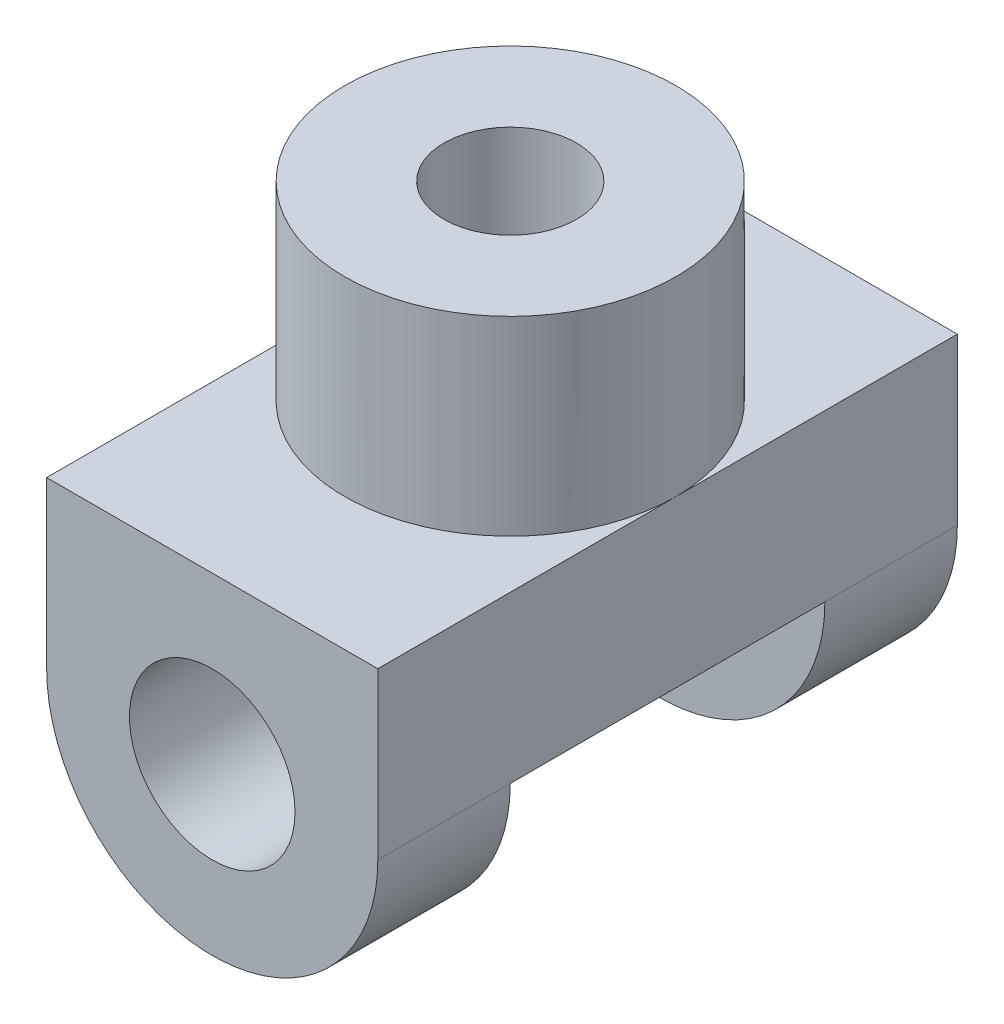
ISO-10303-21;
HEADER;
FILE_DESCRIPTION(('STEP AP214'),'2;1');
FILE_NAME('part.step','',(''),(''),'','','');
FILE_SCHEMA(('AUTOMOTIVE_DESIGN { 1 0 10303 214 1 1 1 1 }'));
ENDSEC;
DATA;
#1=APPLICATION_CONTEXT('core data for automotive mechanical design processes');
#2=APPLICATION_PROTOCOL_DEFINITION('international standard','automotive_design',2000,#1);
#3=PRODUCT_CONTEXT('',#1,'mechanical');
#4=PRODUCT('Part','Part','',(#3));
#5=PRODUCT_RELATED_PRODUCT_CATEGORY('part','',(#4));
#6=PRODUCT_DEFINITION_FORMATION('','',#4);
#7=PRODUCT_DEFINITION_CONTEXT('part definition',#1,'design');
#8=PRODUCT_DEFINITION('design','',#6,#7);
#9=PRODUCT_DEFINITION_SHAPE('','',#8);
#10=(LENGTH_UNIT() NAMED_UNIT(*) SI_UNIT(.MILLI.,.METRE.));
#11=(NAMED_UNIT(*) PLANE_ANGLE_UNIT() SI_UNIT($,.RADIAN.));
#12=(NAMED_UNIT(*) SI_UNIT($,.STERADIAN.) SOLID_ANGLE_UNIT());
#13=UNCERTAINTY_MEASURE_WITH_UNIT(LENGTH_MEASURE(1.E-05),#10,'distance_accuracy_value','');
#14=(GEOMETRIC_REPRESENTATION_CONTEXT(3) GLOBAL_UNCERTAINTY_ASSIGNED_CONTEXT((#13)) GLOBAL_UNIT_ASSIGNED_CONTEXT((#10,
#11,#12)) REPRESENTATION_CONTEXT('',''));
#15=CARTESIAN_POINT('',(0.,0.,0.));
#16=DIRECTION('',(0.,0.,1.));
#17=DIRECTION('',(1.,0.,0.));
#18=AXIS2_PLACEMENT_3D('',#15,#16,#17);
#19=CARTESIAN_POINT('',(0.,0.,-482.6));
#20=DIRECTION('',(0.,0.,-1.));
#21=DIRECTION('',(1.,0.,0.));
#22=AXIS2_PLACEMENT_3D('',#19,#20,#21);
#23=PLANE('',#22);
#24=CARTESIAN_POINT('',(0.,0.,-482.6));
#25=DIRECTION('',(0.,0.,-1.));
#26=DIRECTION('',(-1.,0.,0.));
#27=AXIS2_PLACEMENT_3D('',#24,#25,#26);
#28=CIRCLE('',#27,254.);
#29=CARTESIAN_POINT('',(254.,0.,-482.6));
#30=VERTEX_POINT('',#29);
#31=CARTESIAN_POINT('',(-254.,0.,-482.6));
#32=VERTEX_POINT('',#31);
#33=EDGE_CURVE('E113',#30,#32,#28,.T.);
#34=ORIENTED_EDGE('',*,*,#33,.T.);
#35=DIRECTION('',(1.,0.,0.));
#36=VECTOR('',#35,1.);
#37=CARTESIAN_POINT('',(0.,0.,-482.6));
#38=LINE('',#37,#36);
#39=CARTESIAN_POINT('',(-508.,0.,-482.6));
#40=VERTEX_POINT('',#39);
#41=EDGE_CURVE('E115',#40,#32,#38,.T.);
#42=ORIENTED_EDGE('',*,*,#41,.F.);
#43=CARTESIAN_POINT('',(0.,0.,-482.6));
#44=DIRECTION('',(0.,0.,1.));
#45=DIRECTION('',(1.,0.,0.));
#46=AXIS2_PLACEMENT_3D('',#43,#44,#45);
#47=CIRCLE('',#46,508.);
#48=CARTESIAN_POINT('',(508.,0.,-482.6));
#49=VERTEX_POINT('',#48);
#50=EDGE_CURVE('E127',#40,#49,#47,.T.);
#51=ORIENTED_EDGE('',*,*,#50,.T.);
#52=DIRECTION('',(1.,0.,0.));
#53=VECTOR('',#52,1.);
#54=CARTESIAN_POINT('',(0.,0.,-482.6));
#55=LINE('',#54,#53);
#56=EDGE_CURVE('E55',#30,#49,#55,.T.);
#57=ORIENTED_EDGE('',*,*,#56,.F.);
#58=EDGE_LOOP('',(#34,#42,#51,#57));
#59=FACE_BOUND('',#58,.T.);
#60=ADVANCED_FACE('F39',(#59),#23,.F.);
#61=CARTESIAN_POINT('',(0.,0.,0.));
#62=DIRECTION('',(0.,-1.,0.));
#63=DIRECTION('',(0.,0.,-1.));
#64=AXIS2_PLACEMENT_3D('',#61,#62,#63);
#65=PLANE('',#64);
#66=DIRECTION('',(0.,0.,1.));
#67=VECTOR('',#66,1.);
#68=CARTESIAN_POINT('',(254.,0.,-889.001));
#69=LINE('',#68,#67);
#70=CARTESIAN_POINT('',(254.,0.,482.6));
#71=VERTEX_POINT('',#70);
#72=EDGE_CURVE('E135',#71,#30,#69,.F.);
#73=ORIENTED_EDGE('',*,*,#72,.T.);
#74=ORIENTED_EDGE('',*,*,#56,.T.);
#75=DIRECTION('',(0.,0.,-1.));
#76=VECTOR('',#75,1.);
#77=CARTESIAN_POINT('',(508.,0.,889.));
#78=LINE('',#77,#76);
#79=CARTESIAN_POINT('',(508.,0.,482.6));
#80=VERTEX_POINT('',#79);
#81=EDGE_CURVE('E168',#80,#49,#78,.T.);
#82=ORIENTED_EDGE('',*,*,#81,.F.);
#83=DIRECTION('',(-1.,0.,0.));
#84=VECTOR('',#83,1.);
#85=CARTESIAN_POINT('',(0.,0.,482.6));
#86=LINE('',#85,#84);
#87=EDGE_CURVE('E11',#80,#71,#86,.T.);
#88=ORIENTED_EDGE('',*,*,#87,.T.);
#89=EDGE_LOOP('',(#73,#74,#82,#88));
#90=FACE_BOUND('',#89,.T.);
#91=ADVANCED_FACE('F226',(#90),#65,.T.);
#92=DIRECTION('',(0.,0.,1.));
#93=VECTOR('',#92,1.);
#94=CARTESIAN_POINT('',(-508.,0.,889.));
#95=LINE('',#94,#93);
#96=CARTESIAN_POINT('',(-508.,0.,482.6));
#97=VERTEX_POINT('',#96);
#98=EDGE_CURVE('E63',#40,#97,#95,.T.);
#99=ORIENTED_EDGE('',*,*,#98,.F.);
#100=ORIENTED_EDGE('',*,*,#41,.T.);
#101=DIRECTION('',(0.,0.,1.));
#102=VECTOR('',#101,1.);
#103=CARTESIAN_POINT('',(-254.,0.,-889.001));
#104=LINE('',#103,#102);
#105=CARTESIAN_POINT('',(-254.,0.,482.6));
#106=VERTEX_POINT('',#105);
#107=EDGE_CURVE('E124',#32,#106,#104,.T.);
#108=ORIENTED_EDGE('',*,*,#107,.T.);
#109=EDGE_CURVE('E48',#106,#97,#86,.T.);
#110=ORIENTED_EDGE('',*,*,#109,.T.);
#111=EDGE_LOOP('',(#99,#100,#108,#110));
#112=FACE_BOUND('',#111,.T.);
#113=ADVANCED_FACE('F123',(#112),#65,.T.);
#114=CARTESIAN_POINT('',(0.,0.,-889.001));
#115=DIRECTION('',(0.,0.,1.));
#116=DIRECTION('',(1.,0.,0.));
#117=AXIS2_PLACEMENT_3D('',#114,#115,#116);
#118=CYLINDRICAL_SURFACE('',#117,254.);
#119=CARTESIAN_POINT('',(0.,0.,889.));
#120=DIRECTION('',(0.,0.,1.));
#121=DIRECTION('',(1.,0.,0.));
#122=AXIS2_PLACEMENT_3D('',#119,#120,#121);
#123=CIRCLE('',#122,254.);
#124=CARTESIAN_POINT('',(254.,0.,889.));
#125=VERTEX_POINT('',#124);
#126=EDGE_CURVE('E141',#125,#125,#123,.T.);
#127=ORIENTED_EDGE('',*,*,#126,.T.);
#128=EDGE_LOOP('',(#127));
#129=FACE_BOUND('',#128,.T.);
#130=ORIENTED_EDGE('',*,*,#107,.F.);
#131=ORIENTED_EDGE('',*,*,#33,.F.);
#132=ORIENTED_EDGE('',*,*,#72,.F.);
#133=CARTESIAN_POINT('',(0.,0.,482.6));
#134=DIRECTION('',(0.,0.,1.));
#135=DIRECTION('',(1.,0.,0.));
#136=AXIS2_PLACEMENT_3D('',#133,#134,#135);
#137=CIRCLE('',#136,254.);
#138=EDGE_CURVE('E132',#71,#106,#137,.F.);
#139=ORIENTED_EDGE('',*,*,#138,.T.);
#140=EDGE_LOOP('',(#130,#131,#132,#139));
#141=FACE_BOUND('',#140,.T.);
#142=CARTESIAN_POINT('',(0.,0.,-889.));
#143=DIRECTION('',(0.,0.,1.));
#144=DIRECTION('',(1.,0.,0.));
#145=AXIS2_PLACEMENT_3D('',#142,#143,#144);
#146=CIRCLE('',#145,254.);
#147=CARTESIAN_POINT('',(254.,0.,-889.));
#148=VERTEX_POINT('',#147);
#149=EDGE_CURVE('E121',#148,#148,#146,.T.);
#150=ORIENTED_EDGE('',*,*,#149,.F.);
#151=EDGE_LOOP('',(#150));
#152=FACE_BOUND('',#151,.T.);
#153=ADVANCED_FACE('F129',(#129,#141,#152),#118,.F.);
#154=CARTESIAN_POINT('',(0.,508.,0.));
#155=DIRECTION('',(0.,-1.,0.));
#156=DIRECTION('',(0.,0.,-1.));
#157=AXIS2_PLACEMENT_3D('',#154,#155,#156);
#158=PLANE('',#157);
#159=DIRECTION('',(-1.,0.,0.));
#160=VECTOR('',#159,1.);
#161=CARTESIAN_POINT('',(-508.,508.,-889.));
#162=LINE('',#161,#160);
#163=CARTESIAN_POINT('',(508.,508.,-889.));
#164=VERTEX_POINT('',#163);
#165=CARTESIAN_POINT('',(-508.,508.,-889.));
#166=VERTEX_POINT('',#165);
#167=EDGE_CURVE('E176',#164,#166,#162,.T.);
#168=ORIENTED_EDGE('',*,*,#167,.T.);
#169=DIRECTION('',(0.,0.,1.));
#170=VECTOR('',#169,1.);
#171=CARTESIAN_POINT('',(-508.,508.,889.));
#172=LINE('',#171,#170);
#173=CARTESIAN_POINT('',(-508.,508.,-25.4000000000001));
#174=VERTEX_POINT('',#173);
#175=EDGE_CURVE('E181',#166,#174,#172,.T.);
#176=ORIENTED_EDGE('',*,*,#175,.T.);
#177=CARTESIAN_POINT('',(0.,508.,-25.4000000000001));
#178=DIRECTION('',(0.,1.,0.));
#179=DIRECTION('',(0.,0.,1.));
#180=AXIS2_PLACEMENT_3D('',#177,#178,#179);
#181=CIRCLE('',#180,508.);
#182=CARTESIAN_POINT('',(508.,508.,-25.4000000000001));
#183=VERTEX_POINT('',#182);
#184=EDGE_CURVE('E160',#183,#174,#181,.T.);
#185=ORIENTED_EDGE('',*,*,#184,.F.);
#186=DIRECTION('',(0.,0.,-1.));
#187=VECTOR('',#186,1.);
#188=CARTESIAN_POINT('',(508.,508.,889.));
#189=LINE('',#188,#187);
#190=EDGE_CURVE('E177',#183,#164,#189,.T.);
#191=ORIENTED_EDGE('',*,*,#190,.T.);
#192=EDGE_LOOP('',(#168,#176,#185,#191));
#193=FACE_BOUND('',#192,.T.);
#194=ADVANCED_FACE('F243',(#193),#158,.F.);
#195=CARTESIAN_POINT('',(508.,508.,889.));
#196=DIRECTION('',(-1.,0.,0.));
#197=DIRECTION('',(0.,0.,1.));
#198=AXIS2_PLACEMENT_3D('',#195,#196,#197);
#199=PLANE('',#198);
#200=CARTESIAN_POINT('',(508.,0.,889.));
#201=VERTEX_POINT('',#200);
#202=EDGE_CURVE('E189',#201,#80,#78,.T.);
#203=ORIENTED_EDGE('',*,*,#202,.T.);
#204=ORIENTED_EDGE('',*,*,#81,.T.);
#205=DIRECTION('',(0.,0.,-1.));
#206=VECTOR('',#205,1.);
#207=CARTESIAN_POINT('',(508.,0.,-482.6));
#208=LINE('',#207,#206);
#209=CARTESIAN_POINT('',(508.,0.,-889.));
#210=VERTEX_POINT('',#209);
#211=EDGE_CURVE('E249',#210,#49,#208,.F.);
#212=ORIENTED_EDGE('',*,*,#211,.F.);
#213=DIRECTION('',(0.,-1.,0.));
#214=VECTOR('',#213,1.);
#215=CARTESIAN_POINT('',(508.,508.,-889.));
#216=LINE('',#215,#214);
#217=EDGE_CURVE('E205',#164,#210,#216,.T.);
#218=ORIENTED_EDGE('',*,*,#217,.F.);
#219=ORIENTED_EDGE('',*,*,#190,.F.);
#220=CARTESIAN_POINT('',(508.,508.,889.));
#221=VERTEX_POINT('',#220);
#222=EDGE_CURVE('E172',#221,#183,#189,.T.);
#223=ORIENTED_EDGE('',*,*,#222,.F.);
#224=DIRECTION('',(0.,-1.,0.));
#225=VECTOR('',#224,1.);
#226=CARTESIAN_POINT('',(508.,508.,889.));
#227=LINE('',#226,#225);
#228=EDGE_CURVE('E188',#221,#201,#227,.T.);
#229=ORIENTED_EDGE('',*,*,#228,.T.);
#230=EDGE_LOOP('',(#203,#204,#212,#218,#219,#223,#229));
#231=FACE_BOUND('',#230,.T.);
#232=ADVANCED_FACE('F41',(#231),#199,.F.);
#233=CARTESIAN_POINT('',(-508.,508.,-889.));
#234=DIRECTION('',(0.,0.,1.));
#235=DIRECTION('',(1.,0.,0.));
#236=AXIS2_PLACEMENT_3D('',#233,#234,#235);
#237=PLANE('',#236);
#238=ORIENTED_EDGE('',*,*,#149,.T.);
#239=EDGE_LOOP('',(#238));
#240=FACE_BOUND('',#239,.T.);
#241=CARTESIAN_POINT('',(0.,0.,-889.));
#242=DIRECTION('',(0.,0.,1.));
#243=DIRECTION('',(1.,0.,0.));
#244=AXIS2_PLACEMENT_3D('',#241,#242,#243);
#245=CIRCLE('',#244,508.);
#246=CARTESIAN_POINT('',(-508.,0.,-889.));
#247=VERTEX_POINT('',#246);
#248=EDGE_CURVE('E120',#247,#210,#245,.T.);
#249=ORIENTED_EDGE('',*,*,#248,.F.);
#250=DIRECTION('',(0.,-1.,0.));
#251=VECTOR('',#250,1.);
#252=CARTESIAN_POINT('',(-508.,508.,-889.));
#253=LINE('',#252,#251);
#254=EDGE_CURVE('E203',#166,#247,#253,.T.);
#255=ORIENTED_EDGE('',*,*,#254,.F.);
#256=ORIENTED_EDGE('',*,*,#167,.F.);
#257=ORIENTED_EDGE('',*,*,#217,.T.);
#258=EDGE_LOOP('',(#249,#255,#256,#257));
#259=FACE_BOUND('',#258,.T.);
#260=ADVANCED_FACE('F245',(#240,#259),#237,.F.);
#261=CARTESIAN_POINT('',(-508.,508.,889.));
#262=DIRECTION('',(1.,0.,0.));
#263=DIRECTION('',(0.,0.,-1.));
#264=AXIS2_PLACEMENT_3D('',#261,#262,#263);
#265=PLANE('',#264);
#266=EDGE_CURVE('E193',#247,#40,#95,.T.);
#267=ORIENTED_EDGE('',*,*,#266,.T.);
#268=ORIENTED_EDGE('',*,*,#98,.T.);
#269=DIRECTION('',(0.,0.,1.));
#270=VECTOR('',#269,1.);
#271=CARTESIAN_POINT('',(-508.,0.,482.6));
#272=LINE('',#271,#270);
#273=CARTESIAN_POINT('',(-508.,0.,889.));
#274=VERTEX_POINT('',#273);
#275=EDGE_CURVE('E149',#274,#97,#272,.F.);
#276=ORIENTED_EDGE('',*,*,#275,.F.);
#277=DIRECTION('',(0.,-1.,0.));
#278=VECTOR('',#277,1.);
#279=CARTESIAN_POINT('',(-508.,508.,889.));
#280=LINE('',#279,#278);
#281=CARTESIAN_POINT('',(-508.,508.,889.));
#282=VERTEX_POINT('',#281);
#283=EDGE_CURVE('E199',#282,#274,#280,.T.);
#284=ORIENTED_EDGE('',*,*,#283,.F.);
#285=EDGE_CURVE('E180',#174,#282,#172,.T.);
#286=ORIENTED_EDGE('',*,*,#285,.F.);
#287=ORIENTED_EDGE('',*,*,#175,.F.);
#288=ORIENTED_EDGE('',*,*,#254,.T.);
#289=EDGE_LOOP('',(#267,#268,#276,#284,#286,#287,#288));
#290=FACE_BOUND('',#289,.T.);
#291=ADVANCED_FACE('F237',(#290),#265,.F.);
#292=CARTESIAN_POINT('',(-508.,508.,889.));
#293=DIRECTION('',(0.,0.,-1.));
#294=DIRECTION('',(-1.,0.,0.));
#295=AXIS2_PLACEMENT_3D('',#292,#293,#294);
#296=PLANE('',#295);
#297=ORIENTED_EDGE('',*,*,#126,.F.);
#298=EDGE_LOOP('',(#297));
#299=FACE_BOUND('',#298,.T.);
#300=ORIENTED_EDGE('',*,*,#228,.F.);
#301=DIRECTION('',(1.,0.,0.));
#302=VECTOR('',#301,1.);
#303=CARTESIAN_POINT('',(-508.,508.,889.));
#304=LINE('',#303,#302);
#305=EDGE_CURVE('E185',#282,#221,#304,.T.);
#306=ORIENTED_EDGE('',*,*,#305,.F.);
#307=ORIENTED_EDGE('',*,*,#283,.T.);
#308=CARTESIAN_POINT('',(0.,0.,889.));
#309=DIRECTION('',(0.,0.,1.));
#310=DIRECTION('',(1.,0.,0.));
#311=AXIS2_PLACEMENT_3D('',#308,#309,#310);
#312=CIRCLE('',#311,508.);
#313=EDGE_CURVE('E139',#274,#201,#312,.T.);
#314=ORIENTED_EDGE('',*,*,#313,.T.);
#315=EDGE_LOOP('',(#300,#306,#307,#314));
#316=FACE_BOUND('',#315,.T.);
#317=ADVANCED_FACE('F235',(#299,#316),#296,.F.);
#318=ORIENTED_EDGE('',*,*,#222,.T.);
#319=EDGE_CURVE('E171',#174,#183,#181,.T.);
#320=ORIENTED_EDGE('',*,*,#319,.F.);
#321=ORIENTED_EDGE('',*,*,#285,.T.);
#322=ORIENTED_EDGE('',*,*,#305,.T.);
#323=EDGE_LOOP('',(#318,#320,#321,#322));
#324=FACE_BOUND('',#323,.T.);
#325=ADVANCED_FACE('F265',(#324),#158,.F.);
#326=CARTESIAN_POINT('',(0.,1092.2,-25.4000000000001));
#327=DIRECTION('',(0.,1.,0.));
#328=DIRECTION('',(0.,0.,1.));
#329=AXIS2_PLACEMENT_3D('',#326,#327,#328);
#330=PLANE('',#329);
#331=CARTESIAN_POINT('',(0.,1092.2,-25.4000000000001));
#332=DIRECTION('',(0.,1.,0.));
#333=DIRECTION('',(0.,0.,1.));
#334=AXIS2_PLACEMENT_3D('',#331,#332,#333);
#335=CIRCLE('',#334,508.);
#336=CARTESIAN_POINT('',(0.,1092.2,482.6));
#337=VERTEX_POINT('',#336);
#338=EDGE_CURVE('E164',#337,#337,#335,.T.);
#339=ORIENTED_EDGE('',*,*,#338,.T.);
#340=EDGE_LOOP('',(#339));
#341=FACE_BOUND('',#340,.T.);
#342=CARTESIAN_POINT('',(0.,1092.2,-25.4000000000001));
#343=DIRECTION('',(0.,1.,0.));
#344=DIRECTION('',(0.,0.,1.));
#345=AXIS2_PLACEMENT_3D('',#342,#343,#344);
#346=CIRCLE('',#345,203.2);
#347=CARTESIAN_POINT('',(0.,1092.2,177.8));
#348=VERTEX_POINT('',#347);
#349=EDGE_CURVE('E156',#348,#348,#346,.T.);
#350=ORIENTED_EDGE('',*,*,#349,.F.);
#351=EDGE_LOOP('',(#350));
#352=FACE_BOUND('',#351,.T.);
#353=ADVANCED_FACE('F271',(#341,#352),#330,.T.);
#354=CARTESIAN_POINT('',(0.,1092.2,-25.4000000000001));
#355=DIRECTION('',(0.,-1.,0.));
#356=DIRECTION('',(0.,0.,-1.));
#357=AXIS2_PLACEMENT_3D('',#354,#355,#356);
#358=CYLINDRICAL_SURFACE('',#357,508.);
#359=ORIENTED_EDGE('',*,*,#338,.F.);
#360=EDGE_LOOP('',(#359));
#361=FACE_BOUND('',#360,.T.);
#362=ORIENTED_EDGE('',*,*,#184,.T.);
#363=ORIENTED_EDGE('',*,*,#319,.T.);
#364=EDGE_LOOP('',(#362,#363));
#365=FACE_BOUND('',#364,.T.);
#366=ADVANCED_FACE('F293',(#361,#365),#358,.T.);
#367=CARTESIAN_POINT('',(0.,1092.2,-25.4000000000001));
#368=DIRECTION('',(0.,-1.,0.));
#369=DIRECTION('',(0.,0.,-1.));
#370=AXIS2_PLACEMENT_3D('',#367,#368,#369);
#371=CYLINDRICAL_SURFACE('',#370,203.2);
#372=ORIENTED_EDGE('',*,*,#349,.T.);
#373=EDGE_LOOP('',(#372));
#374=FACE_BOUND('',#373,.T.);
#375=CARTESIAN_POINT('',(0.,508.,-25.4000000000001));
#376=DIRECTION('',(0.,1.,0.));
#377=DIRECTION('',(0.,0.,1.));
#378=AXIS2_PLACEMENT_3D('',#375,#376,#377);
#379=CIRCLE('',#378,203.2);
#380=CARTESIAN_POINT('',(0.,508.,177.8));
#381=VERTEX_POINT('',#380);
#382=EDGE_CURVE('E155',#381,#381,#379,.T.);
#383=ORIENTED_EDGE('',*,*,#382,.F.);
#384=EDGE_LOOP('',(#383));
#385=FACE_BOUND('',#384,.T.);
#386=ADVANCED_FACE('F290',(#374,#385),#371,.F.);
#387=ORIENTED_EDGE('',*,*,#382,.T.);
#388=EDGE_LOOP('',(#387));
#389=FACE_BOUND('',#388,.T.);
#390=ADVANCED_FACE('F273',(#389),#158,.F.);
#391=CARTESIAN_POINT('',(0.,0.,482.6));
#392=DIRECTION('',(0.,0.,1.));
#393=DIRECTION('',(1.,0.,0.));
#394=AXIS2_PLACEMENT_3D('',#391,#392,#393);
#395=CYLINDRICAL_SURFACE('',#394,508.);
#396=CARTESIAN_POINT('',(0.,0.,482.6));
#397=DIRECTION('',(0.,0.,1.));
#398=DIRECTION('',(1.,0.,0.));
#399=AXIS2_PLACEMENT_3D('',#396,#397,#398);
#400=CIRCLE('',#399,508.);
#401=EDGE_CURVE('E145',#97,#80,#400,.T.);
#402=ORIENTED_EDGE('',*,*,#401,.T.);
#403=ORIENTED_EDGE('',*,*,#202,.F.);
#404=ORIENTED_EDGE('',*,*,#313,.F.);
#405=ORIENTED_EDGE('',*,*,#275,.T.);
#406=EDGE_LOOP('',(#402,#403,#404,#405));
#407=FACE_BOUND('',#406,.T.);
#408=ADVANCED_FACE('F221',(#407),#395,.T.);
#409=CARTESIAN_POINT('',(0.,0.,482.6));
#410=DIRECTION('',(0.,0.,1.));
#411=DIRECTION('',(1.,0.,0.));
#412=AXIS2_PLACEMENT_3D('',#409,#410,#411);
#413=PLANE('',#412);
#414=ORIENTED_EDGE('',*,*,#109,.F.);
#415=ORIENTED_EDGE('',*,*,#138,.F.);
#416=ORIENTED_EDGE('',*,*,#87,.F.);
#417=ORIENTED_EDGE('',*,*,#401,.F.);
#418=EDGE_LOOP('',(#414,#415,#416,#417));
#419=FACE_BOUND('',#418,.T.);
#420=ADVANCED_FACE('F225',(#419),#413,.F.);
#421=CARTESIAN_POINT('',(0.,0.,-482.6));
#422=DIRECTION('',(0.,0.,-1.));
#423=DIRECTION('',(-1.,0.,0.));
#424=AXIS2_PLACEMENT_3D('',#421,#422,#423);
#425=CYLINDRICAL_SURFACE('',#424,508.);
#426=ORIENTED_EDGE('',*,*,#248,.T.);
#427=ORIENTED_EDGE('',*,*,#211,.T.);
#428=ORIENTED_EDGE('',*,*,#50,.F.);
#429=ORIENTED_EDGE('',*,*,#266,.F.);
#430=EDGE_LOOP('',(#426,#427,#428,#429));
#431=FACE_BOUND('',#430,.T.);
#432=ADVANCED_FACE('F248',(#431),#425,.T.);
#433=CLOSED_SHELL('',(#60,#91,#113,#153,#194,#232,#260,#291,#317,#325,#353,#366,#386,#390,#408,
#420,#432));
#434=MANIFOLD_SOLID_BREP('B2',#433);
#435=ADVANCED_BREP_SHAPE_REPRESENTATION('',(#18,#434),#14);
#436=SHAPE_DEFINITION_REPRESENTATION(#9,#435);
ENDSEC;
END-ISO-10303-21;
